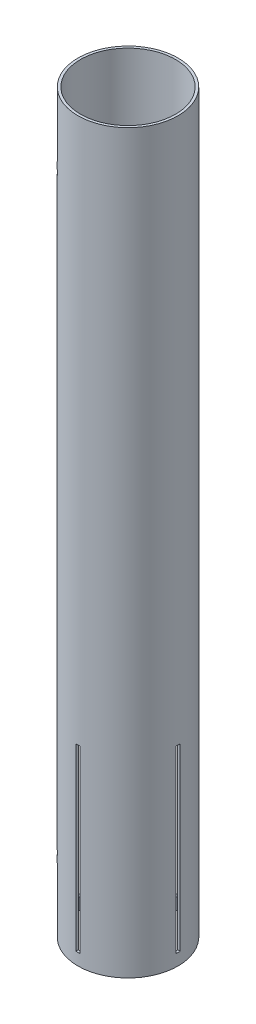
ISO-10303-21;
HEADER;
FILE_DESCRIPTION(('STEP AP214'),'2;1');
FILE_NAME('part.step','',(''),(''),'','','');
FILE_SCHEMA(('AUTOMOTIVE_DESIGN { 1 0 10303 214 1 1 1 1 }'));
ENDSEC;
DATA;
#1=APPLICATION_CONTEXT('core data for automotive mechanical design processes');
#2=APPLICATION_PROTOCOL_DEFINITION('international standard','automotive_design',2000,#1);
#3=PRODUCT_CONTEXT('',#1,'mechanical');
#4=PRODUCT('Part','Part','',(#3));
#5=PRODUCT_RELATED_PRODUCT_CATEGORY('part','',(#4));
#6=PRODUCT_DEFINITION_FORMATION('','',#4);
#7=PRODUCT_DEFINITION_CONTEXT('part definition',#1,'design');
#8=PRODUCT_DEFINITION('design','',#6,#7);
#9=PRODUCT_DEFINITION_SHAPE('','',#8);
#10=(LENGTH_UNIT() NAMED_UNIT(*) SI_UNIT(.MILLI.,.METRE.));
#11=(NAMED_UNIT(*) PLANE_ANGLE_UNIT() SI_UNIT($,.RADIAN.));
#12=(NAMED_UNIT(*) SI_UNIT($,.STERADIAN.) SOLID_ANGLE_UNIT());
#13=UNCERTAINTY_MEASURE_WITH_UNIT(LENGTH_MEASURE(1.E-05),#10,'distance_accuracy_value','');
#14=(GEOMETRIC_REPRESENTATION_CONTEXT(3) GLOBAL_UNCERTAINTY_ASSIGNED_CONTEXT((#13)) GLOBAL_UNIT_ASSIGNED_CONTEXT((#10,
#11,#12)) REPRESENTATION_CONTEXT('',''));
#15=CARTESIAN_POINT('',(0.,0.,0.));
#16=DIRECTION('',(0.,0.,1.));
#17=DIRECTION('',(1.,0.,0.));
#18=AXIS2_PLACEMENT_3D('',#15,#16,#17);
#19=CARTESIAN_POINT('',(0.,500.,0.));
#20=DIRECTION('',(0.,-1.,0.));
#21=DIRECTION('',(0.,0.,-1.));
#22=AXIS2_PLACEMENT_3D('',#19,#20,#21);
#23=CYLINDRICAL_SURFACE('',#22,33.9725);
#24=DIRECTION('',(0.,-1.,0.));
#25=VECTOR('',#24,1.);
#26=CARTESIAN_POINT('',(-33.9393688251564,500.,1.50000000000018));
#27=LINE('',#26,#25);
#28=CARTESIAN_POINT('',(-33.9393688251564,130.,1.50000000000013));
#29=VERTEX_POINT('',#28);
#30=CARTESIAN_POINT('',(-33.9393688251564,8.00000000000001,1.50000000000012));
#31=VERTEX_POINT('',#30);
#32=EDGE_CURVE('E240',#29,#31,#27,.T.);
#33=ORIENTED_EDGE('',*,*,#32,.T.);
#34=CARTESIAN_POINT('',(0.,8.00000000000001,0.));
#35=DIRECTION('',(0.,-1.,0.));
#36=DIRECTION('',(0.,0.,-1.));
#37=AXIS2_PLACEMENT_3D('',#34,#35,#36);
#38=CIRCLE('',#37,33.9725);
#39=CARTESIAN_POINT('',(-33.9393688251564,8.00000000000001,-1.49999999999988));
#40=VERTEX_POINT('',#39);
#41=EDGE_CURVE('E54',#31,#40,#38,.T.);
#42=ORIENTED_EDGE('',*,*,#41,.T.);
#43=DIRECTION('',(0.,-1.,0.));
#44=VECTOR('',#43,1.);
#45=CARTESIAN_POINT('',(-33.9393688251564,500.,-1.49999999999994));
#46=LINE('',#45,#44);
#47=CARTESIAN_POINT('',(-33.9393688251564,130.,-1.4999999999999));
#48=VERTEX_POINT('',#47);
#49=EDGE_CURVE('E172',#40,#48,#46,.F.);
#50=ORIENTED_EDGE('',*,*,#49,.T.);
#51=CARTESIAN_POINT('',(0.,130.,0.));
#52=DIRECTION('',(0.,1.,0.));
#53=DIRECTION('',(0.,0.,1.));
#54=AXIS2_PLACEMENT_3D('',#51,#52,#53);
#55=CIRCLE('',#54,33.9725);
#56=EDGE_CURVE('E234',#48,#29,#55,.T.);
#57=ORIENTED_EDGE('',*,*,#56,.T.);
#58=EDGE_LOOP('',(#33,#42,#50,#57));
#59=FACE_BOUND('',#58,.T.);
#60=DIRECTION('',(0.,-1.,0.));
#61=VECTOR('',#60,1.);
#62=CARTESIAN_POINT('',(33.9393688251564,500.,-1.50000000000018));
#63=LINE('',#62,#61);
#64=CARTESIAN_POINT('',(33.9393688251564,130.,-1.50000000000013));
#65=VERTEX_POINT('',#64);
#66=CARTESIAN_POINT('',(33.9393688251564,8.00000000000001,-1.50000000000012));
#67=VERTEX_POINT('',#66);
#68=EDGE_CURVE('E220',#65,#67,#63,.T.);
#69=ORIENTED_EDGE('',*,*,#68,.T.);
#70=CARTESIAN_POINT('',(33.9393688251564,8.00000000000001,1.49999999999988));
#71=VERTEX_POINT('',#70);
#72=EDGE_CURVE('E62',#67,#71,#38,.T.);
#73=ORIENTED_EDGE('',*,*,#72,.T.);
#74=DIRECTION('',(0.,-1.,0.));
#75=VECTOR('',#74,1.);
#76=CARTESIAN_POINT('',(33.9393688251564,500.,1.49999999999994));
#77=LINE('',#76,#75);
#78=CARTESIAN_POINT('',(33.9393688251564,130.,1.4999999999999));
#79=VERTEX_POINT('',#78);
#80=EDGE_CURVE('E210',#71,#79,#77,.F.);
#81=ORIENTED_EDGE('',*,*,#80,.T.);
#82=EDGE_CURVE('E235',#79,#65,#55,.T.);
#83=ORIENTED_EDGE('',*,*,#82,.T.);
#84=EDGE_LOOP('',(#69,#73,#81,#83));
#85=FACE_BOUND('',#84,.T.);
#86=DIRECTION('',(0.,-1.,0.));
#87=VECTOR('',#86,1.);
#88=CARTESIAN_POINT('',(1.50000000000006,500.,-33.9393688251564));
#89=LINE('',#88,#87);
#90=CARTESIAN_POINT('',(1.5,8.00000000000001,-33.9393688251564));
#91=VERTEX_POINT('',#90);
#92=CARTESIAN_POINT('',(1.50000000000001,130.,-33.9393688251564));
#93=VERTEX_POINT('',#92);
#94=EDGE_CURVE('E267',#91,#93,#89,.F.);
#95=ORIENTED_EDGE('',*,*,#94,.T.);
#96=CARTESIAN_POINT('',(0.,130.,0.));
#97=DIRECTION('',(0.,1.,0.));
#98=DIRECTION('',(0.,0.,1.));
#99=AXIS2_PLACEMENT_3D('',#96,#97,#98);
#100=CIRCLE('',#99,33.9725);
#101=CARTESIAN_POINT('',(-1.50000000000001,130.,-33.9393688251564));
#102=VERTEX_POINT('',#101);
#103=EDGE_CURVE('E278',#93,#102,#100,.T.);
#104=ORIENTED_EDGE('',*,*,#103,.T.);
#105=DIRECTION('',(0.,-1.,0.));
#106=VECTOR('',#105,1.);
#107=CARTESIAN_POINT('',(-1.50000000000006,500.,-33.9393688251564));
#108=LINE('',#107,#106);
#109=CARTESIAN_POINT('',(-1.5,8.00000000000001,-33.9393688251564));
#110=VERTEX_POINT('',#109);
#111=EDGE_CURVE('E283',#102,#110,#108,.T.);
#112=ORIENTED_EDGE('',*,*,#111,.T.);
#113=CARTESIAN_POINT('',(0.,8.00000000000001,0.));
#114=DIRECTION('',(0.,-1.,0.));
#115=DIRECTION('',(0.,0.,-1.));
#116=AXIS2_PLACEMENT_3D('',#113,#114,#115);
#117=CIRCLE('',#116,33.9725);
#118=EDGE_CURVE('E263',#110,#91,#117,.T.);
#119=ORIENTED_EDGE('',*,*,#118,.T.);
#120=EDGE_LOOP('',(#95,#104,#112,#119));
#121=FACE_BOUND('',#120,.T.);
#122=CARTESIAN_POINT('',(-1.50000000000001,130.,33.9393688251564));
#123=VERTEX_POINT('',#122);
#124=CARTESIAN_POINT('',(1.50000000000001,130.,33.9393688251564));
#125=VERTEX_POINT('',#124);
#126=EDGE_CURVE('E275',#123,#125,#100,.T.);
#127=ORIENTED_EDGE('',*,*,#126,.T.);
#128=DIRECTION('',(0.,-1.,0.));
#129=VECTOR('',#128,1.);
#130=CARTESIAN_POINT('',(1.50000000000006,500.,33.9393688251564));
#131=LINE('',#130,#129);
#132=CARTESIAN_POINT('',(1.5,8.00000000000001,33.9393688251564));
#133=VERTEX_POINT('',#132);
#134=EDGE_CURVE('E271',#125,#133,#131,.T.);
#135=ORIENTED_EDGE('',*,*,#134,.T.);
#136=CARTESIAN_POINT('',(-1.5,8.00000000000001,33.9393688251564));
#137=VERTEX_POINT('',#136);
#138=EDGE_CURVE('E266',#133,#137,#117,.T.);
#139=ORIENTED_EDGE('',*,*,#138,.T.);
#140=DIRECTION('',(0.,-1.,0.));
#141=VECTOR('',#140,1.);
#142=CARTESIAN_POINT('',(-1.50000000000006,500.,33.9393688251564));
#143=LINE('',#142,#141);
#144=EDGE_CURVE('E279',#137,#123,#143,.F.);
#145=ORIENTED_EDGE('',*,*,#144,.T.);
#146=EDGE_LOOP('',(#127,#135,#139,#145));
#147=FACE_BOUND('',#146,.T.);
#148=CARTESIAN_POINT('',(0.,500.,0.));
#149=DIRECTION('',(0.,1.,0.));
#150=DIRECTION('',(0.,0.,1.));
#151=AXIS2_PLACEMENT_3D('',#148,#149,#150);
#152=CIRCLE('',#151,33.9725);
#153=CARTESIAN_POINT('',(0.,500.,33.9725));
#154=VERTEX_POINT('',#153);
#155=EDGE_CURVE('E335',#154,#154,#152,.T.);
#156=ORIENTED_EDGE('',*,*,#155,.F.);
#157=EDGE_LOOP('',(#156));
#158=FACE_BOUND('',#157,.T.);
#159=CARTESIAN_POINT('',(0.,0.,0.));
#160=DIRECTION('',(0.,1.,0.));
#161=DIRECTION('',(0.,0.,1.));
#162=AXIS2_PLACEMENT_3D('',#159,#160,#161);
#163=CIRCLE('',#162,33.9725);
#164=CARTESIAN_POINT('',(0.,0.,33.9725));
#165=VERTEX_POINT('',#164);
#166=EDGE_CURVE('E323',#165,#165,#163,.T.);
#167=ORIENTED_EDGE('',*,*,#166,.T.);
#168=EDGE_LOOP('',(#167));
#169=FACE_BOUND('',#168,.T.);
#170=CARTESIAN_POINT('',(-25.2277292397217,450.,22.7528555055688));
#171=CARTESIAN_POINT('',(-25.2277266034803,449.901771722254,22.7528589982742));
#172=CARTESIAN_POINT('',(-25.2221664334747,449.80347387983,22.7590280902573));
#173=CARTESIAN_POINT('',(-25.2000396947857,449.609590171231,22.7835251344659));
#174=CARTESIAN_POINT('',(-25.1834601749632,449.514007634383,22.8018673938856));
#175=CARTESIAN_POINT('',(-25.1396960712382,449.328391176225,22.8501092383086));
#176=CARTESIAN_POINT('',(-25.1125169144157,449.238354442703,22.880002908846));
#177=CARTESIAN_POINT('',(-25.0482190955016,449.066357482103,22.9503755311126));
#178=CARTESIAN_POINT('',(-25.0111027718967,448.984395361047,22.9908519923699));
#179=CARTESIAN_POINT('',(-24.9277986928767,448.830762557362,23.0811475895228));
#180=CARTESIAN_POINT('',(-24.8816024984054,448.759101556947,23.1309754148467));
#181=CARTESIAN_POINT('',(-24.7813129701339,448.628187775444,23.2383878778816));
#182=CARTESIAN_POINT('',(-24.7272193133742,448.56893550204,23.2959728328061));
#183=CARTESIAN_POINT('',(-24.6124880635756,448.464494147677,23.4171548825114));
#184=CARTESIAN_POINT('',(-24.5518469630713,448.419312655278,23.4807551974355));
#185=CARTESIAN_POINT('',(-24.4256398741204,448.344344090873,23.6120129109985));
#186=CARTESIAN_POINT('',(-24.3600739246336,448.3145568971,23.6796702775418));
#187=CARTESIAN_POINT('',(-24.2258526050935,448.271248184254,23.8169692695279));
#188=CARTESIAN_POINT('',(-24.1572000566488,448.25771211075,23.8866090622001));
#189=CARTESIAN_POINT('',(-24.0186615285966,448.247244958155,24.0259089839155));
#190=CARTESIAN_POINT('',(-23.9487755591587,448.250313742219,24.0955691127863));
#191=CARTESIAN_POINT('',(-23.8098336197974,448.272957123338,24.2328725576708));
#192=CARTESIAN_POINT('',(-23.7407769252323,448.292516055707,24.3005177246648));
#193=CARTESIAN_POINT('',(-23.6054433389453,448.347560241705,24.4320017227964));
#194=CARTESIAN_POINT('',(-23.5391664594055,448.383045565121,24.4958405372539));
#195=CARTESIAN_POINT('',(-23.4113399425348,448.468953082202,24.6180370699147));
#196=CARTESIAN_POINT('',(-23.3497925803822,448.519382408869,24.6763921530897));
#197=CARTESIAN_POINT('',(-23.2333334625154,448.633741221555,24.7860723333918));
#198=CARTESIAN_POINT('',(-23.1784217567041,448.69767080909,24.8373973776504));
#199=CARTESIAN_POINT('',(-23.0768766634649,448.837303964168,24.9317737335363));
#200=CARTESIAN_POINT('',(-23.0302529668191,448.913021122926,24.9748153645488));
#201=CARTESIAN_POINT('',(-22.9468351575928,449.074032355847,25.0514816462202));
#202=CARTESIAN_POINT('',(-22.9100410477466,449.159326432674,25.0851062942597));
#203=CARTESIAN_POINT('',(-22.8474615765983,449.337078630856,25.1421171864754));
#204=CARTESIAN_POINT('',(-22.8216765976554,449.429537000902,25.1655030750491));
#205=CARTESIAN_POINT('',(-22.7819555523918,449.618989469516,25.2014678457572));
#206=CARTESIAN_POINT('',(-22.7680193914827,449.71598353187,25.2140468141625));
#207=CARTESIAN_POINT('',(-22.7524616005571,449.911634740305,25.2280867177168));
#208=CARTESIAN_POINT('',(-22.7508258384585,450.010289847286,25.2295604118584));
#209=CARTESIAN_POINT('',(-22.7598852315661,450.20656758908,25.2213880719538));
#210=CARTESIAN_POINT('',(-22.7705803434462,450.30419022752,25.2117420769781));
#211=CARTESIAN_POINT('',(-22.8039418778366,450.49557843173,25.1815704685149));
#212=CARTESIAN_POINT('',(-22.8266018477532,450.589346047145,25.1610507191723));
#213=CARTESIAN_POINT('',(-22.8831531488593,450.770425639233,25.1096298328353));
#214=CARTESIAN_POINT('',(-22.9170445490861,450.857737576219,25.0787286320281));
#215=CARTESIAN_POINT('',(-22.9950067522489,451.02351481093,25.0072631250145));
#216=CARTESIAN_POINT('',(-23.0390868188333,451.101971960579,24.966690023951));
#217=CARTESIAN_POINT('',(-23.1360132165445,451.247730534738,24.8768969429841));
#218=CARTESIAN_POINT('',(-23.1888596069598,451.315031883793,24.8276769045997));
#219=CARTESIAN_POINT('',(-23.3017254178744,451.436632351833,24.7217784812312));
#220=CARTESIAN_POINT('',(-23.3617515361043,451.490919185957,24.6650931270415));
#221=CARTESIAN_POINT('',(-23.4870955845484,451.584865628034,24.5457649072287));
#222=CARTESIAN_POINT('',(-23.5524134906732,451.62452530257,24.4831220687253));
#223=CARTESIAN_POINT('',(-23.6863412881098,451.688070164211,24.3535759355349));
#224=CARTESIAN_POINT('',(-23.7549495229567,451.711963201193,24.2866747791946));
#225=CARTESIAN_POINT('',(-23.8934659842238,451.743322257247,24.1504135380807));
#226=CARTESIAN_POINT('',(-23.9633742027116,451.750788376523,24.0810534683089));
#227=CARTESIAN_POINT('',(-24.1023969106473,451.74908070823,23.9419063768542));
#228=CARTESIAN_POINT('',(-24.1715122257146,451.739926185597,23.8721199428007));
#229=CARTESIAN_POINT('',(-24.3070974688914,451.705276934037,23.7340501098141));
#230=CARTESIAN_POINT('',(-24.373567392049,451.679782174525,23.6657667136945));
#231=CARTESIAN_POINT('',(-24.5020540258313,451.613180146834,23.5327147874738));
#232=CARTESIAN_POINT('',(-24.5640707095064,451.572072784183,23.4679462786443));
#233=CARTESIAN_POINT('',(-24.6820106467878,451.475415679703,23.3438737677258));
#234=CARTESIAN_POINT('',(-24.7379340841945,451.419866373681,23.2845696008153));
#235=CARTESIAN_POINT('',(-24.842308287082,451.295832910427,23.1731810058969));
#236=CARTESIAN_POINT('',(-24.8907511538322,451.227335248433,23.1211042150661));
#237=CARTESIAN_POINT('',(-24.9788874885179,451.079359773493,23.025858487679));
#238=CARTESIAN_POINT('',(-25.0185788021105,450.99987926475,22.9826917446484));
#239=CARTESIAN_POINT('',(-25.0882514438885,450.832128656658,22.906616244457));
#240=CARTESIAN_POINT('',(-25.1182231184705,450.743849931911,22.8737176869295));
#241=CARTESIAN_POINT('',(-25.1676454542652,450.561136716784,22.8193282493466));
#242=CARTESIAN_POINT('',(-25.1871085315654,450.46670963933,22.7978239073935));
#243=CARTESIAN_POINT('',(-25.2099496956917,450.309747371028,22.7725570452397));
#244=CARTESIAN_POINT('',(-25.2166096314108,450.248228640408,22.7651795444053));
#245=CARTESIAN_POINT('',(-25.2255002368035,450.124482586984,22.7553276700029));
#246=CARTESIAN_POINT('',(-25.2277309105227,450.062255264827,22.7528532919567));
#247=CARTESIAN_POINT('',(-25.2277292397217,450.,22.7528555055688));
#248=B_SPLINE_CURVE_WITH_KNOTS('',3,(#170,#171,#172,#173,#174,#175,#176,#177,#178,#179,#180,
#181,#182,#183,#184,#185,#186,#187,#188,#189,#190,#191,#192,#193,#194,#195,#196,#197,#198,#199,
#200,#201,#202,#203,#204,#205,#206,#207,#208,#209,#210,#211,#212,#213,#214,#215,#216,#217,#218,
#219,#220,#221,#222,#223,#224,#225,#226,#227,#228,#229,#230,#231,#232,#233,#234,#235,#236,#237,
#238,#239,#240,#241,#242,#243,#244,#245,#246,#247),.UNSPECIFIED.,.T.,.F.,(4,2,2,2,2,2,2,2,2,2,2,
2,2,2,2,2,2,2,2,2,2,2,2,2,2,2,2,2,2,2,2,2,2,2,2,2,2,2,4),(0.,0.294457575932065,
0.589261843891894,0.883915367981892,1.17849961290835,1.47335895755836,1.76823036359738,
2.06326052342507,2.35828834955921,2.65305175253015,2.94781272629011,3.24229400927292,
3.5367765826275,3.83139994405627,4.1260255210379,4.42099335591708,4.71596127284505,
5.01093943350058,5.30591523934223,5.60055209193795,5.89518790929498,6.18966499293851,
6.48414388670897,6.77889158454225,7.07364127589589,7.36866810601911,7.66369359318705,
7.95857208233191,8.2534487727283,8.54798389064392,8.84251955986804,9.13705701138363,
9.43158557582753,9.72642303707439,10.0213329967192,10.316534971952,10.6113873934801,
10.7980093269404,10.9846310899465),.UNSPECIFIED.);
#249=CARTESIAN_POINT('',(-25.2277292397217,450.,22.7528555055688));
#250=VERTEX_POINT('',#249);
#251=EDGE_CURVE('E288',#250,#250,#248,.T.);
#252=ORIENTED_EDGE('',*,*,#251,.F.);
#253=EDGE_LOOP('',(#252));
#254=FACE_BOUND('',#253,.T.);
#255=CARTESIAN_POINT('',(-25.2277292397217,50.,22.7528555055688));
#256=CARTESIAN_POINT('',(-25.2277266034803,49.9017717222543,22.7528589982742));
#257=CARTESIAN_POINT('',(-25.2221664334747,49.8034738798296,22.7590280902573));
#258=CARTESIAN_POINT('',(-25.2000396947857,49.6095901712313,22.7835251344659));
#259=CARTESIAN_POINT('',(-25.1834601749632,49.5140076343827,22.8018673938856));
#260=CARTESIAN_POINT('',(-25.1396960712382,49.3283911762248,22.8501092383086));
#261=CARTESIAN_POINT('',(-25.1125169144157,49.2383544427031,22.880002908846));
#262=CARTESIAN_POINT('',(-25.0482190955016,49.0663574821029,22.9503755311126));
#263=CARTESIAN_POINT('',(-25.0111027718967,48.9843953610473,22.9908519923698));
#264=CARTESIAN_POINT('',(-24.9277986928767,48.8307625573615,23.0811475895228));
#265=CARTESIAN_POINT('',(-24.8816024984053,48.7591015569471,23.1309754148467));
#266=CARTESIAN_POINT('',(-24.7813129701339,48.628187775444,23.2383878778817));
#267=CARTESIAN_POINT('',(-24.7272193133741,48.5689355020404,23.2959728328062));
#268=CARTESIAN_POINT('',(-24.6124880635755,48.4644941476772,23.4171548825115));
#269=CARTESIAN_POINT('',(-24.5518469630713,48.4193126552776,23.4807551974356));
#270=CARTESIAN_POINT('',(-24.4256398741204,48.3443440908729,23.6120129109985));
#271=CARTESIAN_POINT('',(-24.3600739246336,48.3145568971004,23.6796702775418));
#272=CARTESIAN_POINT('',(-24.2258526050935,48.2712481842538,23.8169692695279));
#273=CARTESIAN_POINT('',(-24.1572000566488,48.2577121107499,23.8866090622001));
#274=CARTESIAN_POINT('',(-24.0186615285965,48.2472449581545,24.0259089839155));
#275=CARTESIAN_POINT('',(-23.9487755591586,48.2503137422186,24.0955691127863));
#276=CARTESIAN_POINT('',(-23.8098336197974,48.2729571233376,24.2328725576708));
#277=CARTESIAN_POINT('',(-23.7407769252323,48.2925160557067,24.3005177246648));
#278=CARTESIAN_POINT('',(-23.6054433389453,48.3475602417051,24.4320017227964));
#279=CARTESIAN_POINT('',(-23.5391664594055,48.3830455651208,24.4958405372539));
#280=CARTESIAN_POINT('',(-23.4113399425348,48.4689530822019,24.6180370699147));
#281=CARTESIAN_POINT('',(-23.3497925803822,48.5193824088691,24.6763921530897));
#282=CARTESIAN_POINT('',(-23.2333334625154,48.6337412215546,24.7860723333918));
#283=CARTESIAN_POINT('',(-23.1784217567041,48.6976708090905,24.8373973776505));
#284=CARTESIAN_POINT('',(-23.0768766634649,48.8373039641681,24.9317737335364));
#285=CARTESIAN_POINT('',(-23.0302529668191,48.9130211229257,24.9748153645489));
#286=CARTESIAN_POINT('',(-22.9468351575928,49.0740323558466,25.0514816462202));
#287=CARTESIAN_POINT('',(-22.9100410477466,49.1593264326739,25.0851062942597));
#288=CARTESIAN_POINT('',(-22.8474615765983,49.3370786308556,25.1421171864754));
#289=CARTESIAN_POINT('',(-22.8216765976554,49.4295370009021,25.1655030750491));
#290=CARTESIAN_POINT('',(-22.7819555523918,49.6189894695164,25.2014678457572));
#291=CARTESIAN_POINT('',(-22.7680193914827,49.7159835318697,25.2140468141625));
#292=CARTESIAN_POINT('',(-22.7524616005571,49.9116347403052,25.2280867177168));
#293=CARTESIAN_POINT('',(-22.7508258384585,50.010289847286,25.2295604118584));
#294=CARTESIAN_POINT('',(-22.7598852315661,50.2065675890803,25.2213880719538));
#295=CARTESIAN_POINT('',(-22.7705803434462,50.3041902275203,25.2117420769781));
#296=CARTESIAN_POINT('',(-22.8039418778366,50.4955784317298,25.1815704685149));
#297=CARTESIAN_POINT('',(-22.8266018477532,50.589346047145,25.1610507191723));
#298=CARTESIAN_POINT('',(-22.8831531488593,50.7704256392326,25.1096298328353));
#299=CARTESIAN_POINT('',(-22.9170445490861,50.857737576219,25.0787286320281));
#300=CARTESIAN_POINT('',(-22.9950067522489,51.0235148109297,25.0072631250145));
#301=CARTESIAN_POINT('',(-23.0390868188333,51.101971960579,24.9666900239509));
#302=CARTESIAN_POINT('',(-23.1360132165445,51.247730534738,24.8768969429841));
#303=CARTESIAN_POINT('',(-23.1888596069598,51.3150318837926,24.8276769045996));
#304=CARTESIAN_POINT('',(-23.3017254178744,51.4366323518332,24.7217784812312));
#305=CARTESIAN_POINT('',(-23.3617515361043,51.4909191859567,24.6650931270415));
#306=CARTESIAN_POINT('',(-23.4870955845484,51.5848656280343,24.5457649072287));
#307=CARTESIAN_POINT('',(-23.5524134906733,51.62452530257,24.4831220687252));
#308=CARTESIAN_POINT('',(-23.6863412881099,51.6880701642112,24.3535759355349));
#309=CARTESIAN_POINT('',(-23.7549495229567,51.7119632011932,24.2866747791946));
#310=CARTESIAN_POINT('',(-23.8934659842238,51.7433222572473,24.1504135380806));
#311=CARTESIAN_POINT('',(-23.9633742027117,51.7507883765227,24.0810534683088));
#312=CARTESIAN_POINT('',(-24.1023969106474,51.7490807082304,23.9419063768541));
#313=CARTESIAN_POINT('',(-24.1715122257146,51.7399261855975,23.8721199428007));
#314=CARTESIAN_POINT('',(-24.3070974688914,51.7052769340373,23.7340501098141));
#315=CARTESIAN_POINT('',(-24.373567392049,51.6797821745247,23.6657667136945));
#316=CARTESIAN_POINT('',(-24.5020540258314,51.6131801468339,23.5327147874738));
#317=CARTESIAN_POINT('',(-24.5640707095065,51.5720727841825,23.4679462786443));
#318=CARTESIAN_POINT('',(-24.6820106467878,51.4754156797027,23.3438737677258));
#319=CARTESIAN_POINT('',(-24.7379340841945,51.4198663736814,23.2845696008153));
#320=CARTESIAN_POINT('',(-24.842308287082,51.2958329104272,23.1731810058969));
#321=CARTESIAN_POINT('',(-24.8907511538323,51.2273352484326,23.1211042150661));
#322=CARTESIAN_POINT('',(-24.9788874885179,51.079359773493,23.025858487679));
#323=CARTESIAN_POINT('',(-25.0185788021105,50.9998792647501,22.9826917446483));
#324=CARTESIAN_POINT('',(-25.0882514438885,50.8321286566577,22.906616244457));
#325=CARTESIAN_POINT('',(-25.1182231184705,50.7438499319105,22.8737176869295));
#326=CARTESIAN_POINT('',(-25.1676454542652,50.5611367167839,22.8193282493466));
#327=CARTESIAN_POINT('',(-25.1871085315654,50.4667096393303,22.7978239073935));
#328=CARTESIAN_POINT('',(-25.2099496956917,50.3097473710276,22.7725570452397));
#329=CARTESIAN_POINT('',(-25.2166096314108,50.2482286404083,22.7651795444053));
#330=CARTESIAN_POINT('',(-25.2255002368035,50.1244825869843,22.7553276700029));
#331=CARTESIAN_POINT('',(-25.2277309105227,50.062255264827,22.7528532919567));
#332=CARTESIAN_POINT('',(-25.2277292397217,50.,22.7528555055688));
#333=B_SPLINE_CURVE_WITH_KNOTS('',3,(#255,#256,#257,#258,#259,#260,#261,#262,#263,#264,#265,
#266,#267,#268,#269,#270,#271,#272,#273,#274,#275,#276,#277,#278,#279,#280,#281,#282,#283,#284,
#285,#286,#287,#288,#289,#290,#291,#292,#293,#294,#295,#296,#297,#298,#299,#300,#301,#302,#303,
#304,#305,#306,#307,#308,#309,#310,#311,#312,#313,#314,#315,#316,#317,#318,#319,#320,#321,#322,
#323,#324,#325,#326,#327,#328,#329,#330,#331,#332),.UNSPECIFIED.,.T.,.F.,(4,2,2,2,2,2,2,2,2,2,2,
2,2,2,2,2,2,2,2,2,2,2,2,2,2,2,2,2,2,2,2,2,2,2,2,2,2,2,4),(0.,0.294457575932148,
0.589261843891917,0.883915367981921,1.17849961290833,1.47335895755843,1.76823036359743,
2.06326052342513,2.35828834955921,2.65305175253016,2.94781272629014,3.24229400927292,
3.53677658262754,3.83139994405629,4.12602552103794,4.42099335591711,4.71596127284509,
5.01093943350063,5.30591523934227,5.60055209193794,5.89518790929496,6.18966499293854,
6.48414388670902,6.77889158454229,7.07364127589595,7.36866810601917,7.66369359318708,
7.95857208233195,8.25344877272834,8.54798389064396,8.84251955986807,9.1370570113837,
9.43158557582758,9.72642303707446,10.0213329967193,10.3165349719521,10.6113873934801,
10.7980093269404,10.9846310899465),.UNSPECIFIED.);
#334=CARTESIAN_POINT('',(-25.2277292397217,50.,22.7528555055688));
#335=VERTEX_POINT('',#334);
#336=EDGE_CURVE('E297',#335,#335,#333,.T.);
#337=ORIENTED_EDGE('',*,*,#336,.F.);
#338=EDGE_LOOP('',(#337));
#339=FACE_BOUND('',#338,.T.);
#340=ADVANCED_FACE('F38',(#59,#85,#121,#147,#158,#169,#254,#339),#23,.T.);
#341=CARTESIAN_POINT('',(0.,500.,0.));
#342=DIRECTION('',(0.,-1.,0.));
#343=DIRECTION('',(0.,0.,-1.));
#344=AXIS2_PLACEMENT_3D('',#341,#342,#343);
#345=CYLINDRICAL_SURFACE('',#344,32.258);
#346=DIRECTION('',(0.,-1.,0.));
#347=VECTOR('',#346,1.);
#348=CARTESIAN_POINT('',(32.2231060576103,500.,1.49999999999995));
#349=LINE('',#348,#347);
#350=CARTESIAN_POINT('',(32.2231060576103,8.00000000000001,1.49999999999989));
#351=VERTEX_POINT('',#350);
#352=CARTESIAN_POINT('',(32.2231060576103,130.,1.4999999999999));
#353=VERTEX_POINT('',#352);
#354=EDGE_CURVE('E11',#351,#353,#349,.F.);
#355=ORIENTED_EDGE('',*,*,#354,.F.);
#356=CARTESIAN_POINT('',(0.,8.00000000000001,0.));
#357=DIRECTION('',(0.,-1.,0.));
#358=DIRECTION('',(0.,0.,-1.));
#359=AXIS2_PLACEMENT_3D('',#356,#357,#358);
#360=CIRCLE('',#359,32.258);
#361=CARTESIAN_POINT('',(32.2231060576103,8.00000000000001,-1.50000000000011));
#362=VERTEX_POINT('',#361);
#363=EDGE_CURVE('E167',#362,#351,#360,.T.);
#364=ORIENTED_EDGE('',*,*,#363,.F.);
#365=DIRECTION('',(0.,-1.,0.));
#366=VECTOR('',#365,1.);
#367=CARTESIAN_POINT('',(32.2231060576103,500.,-1.50000000000017));
#368=LINE('',#367,#366);
#369=CARTESIAN_POINT('',(32.2231060576103,130.,-1.50000000000013));
#370=VERTEX_POINT('',#369);
#371=EDGE_CURVE('E189',#370,#362,#368,.T.);
#372=ORIENTED_EDGE('',*,*,#371,.F.);
#373=CARTESIAN_POINT('',(0.,130.,0.));
#374=DIRECTION('',(0.,1.,0.));
#375=DIRECTION('',(0.,0.,1.));
#376=AXIS2_PLACEMENT_3D('',#373,#374,#375);
#377=CIRCLE('',#376,32.258);
#378=EDGE_CURVE('E47',#353,#370,#377,.T.);
#379=ORIENTED_EDGE('',*,*,#378,.F.);
#380=EDGE_LOOP('',(#355,#364,#372,#379));
#381=FACE_BOUND('',#380,.T.);
#382=DIRECTION('',(0.,-1.,0.));
#383=VECTOR('',#382,1.);
#384=CARTESIAN_POINT('',(-32.2231060576103,500.,1.50000000000017));
#385=LINE('',#384,#383);
#386=CARTESIAN_POINT('',(-32.2231060576103,130.,1.50000000000013));
#387=VERTEX_POINT('',#386);
#388=CARTESIAN_POINT('',(-32.2231060576103,8.00000000000001,1.50000000000011));
#389=VERTEX_POINT('',#388);
#390=EDGE_CURVE('E184',#387,#389,#385,.T.);
#391=ORIENTED_EDGE('',*,*,#390,.F.);
#392=CARTESIAN_POINT('',(-32.2231060576103,130.,-1.4999999999999));
#393=VERTEX_POINT('',#392);
#394=EDGE_CURVE('E180',#393,#387,#377,.T.);
#395=ORIENTED_EDGE('',*,*,#394,.F.);
#396=DIRECTION('',(0.,-1.,0.));
#397=VECTOR('',#396,1.);
#398=CARTESIAN_POINT('',(-32.2231060576103,500.,-1.49999999999995));
#399=LINE('',#398,#397);
#400=CARTESIAN_POINT('',(-32.2231060576103,8.00000000000001,-1.49999999999989));
#401=VERTEX_POINT('',#400);
#402=EDGE_CURVE('E164',#401,#393,#399,.F.);
#403=ORIENTED_EDGE('',*,*,#402,.F.);
#404=EDGE_CURVE('E152',#389,#401,#360,.T.);
#405=ORIENTED_EDGE('',*,*,#404,.F.);
#406=EDGE_LOOP('',(#391,#395,#403,#405));
#407=FACE_BOUND('',#406,.T.);
#408=DIRECTION('',(0.,-1.,0.));
#409=VECTOR('',#408,1.);
#410=CARTESIAN_POINT('',(-1.50000000000006,500.,32.2231060576103));
#411=LINE('',#410,#409);
#412=CARTESIAN_POINT('',(-1.5,8.00000000000001,32.2231060576103));
#413=VERTEX_POINT('',#412);
#414=CARTESIAN_POINT('',(-1.50000000000001,130.,32.2231060576103));
#415=VERTEX_POINT('',#414);
#416=EDGE_CURVE('E165',#413,#415,#411,.F.);
#417=ORIENTED_EDGE('',*,*,#416,.F.);
#418=CARTESIAN_POINT('',(0.,8.00000000000001,0.));
#419=DIRECTION('',(0.,-1.,0.));
#420=DIRECTION('',(0.,0.,-1.));
#421=AXIS2_PLACEMENT_3D('',#418,#419,#420);
#422=CIRCLE('',#421,32.258);
#423=CARTESIAN_POINT('',(1.5,8.00000000000001,32.2231060576103));
#424=VERTEX_POINT('',#423);
#425=EDGE_CURVE('E336',#424,#413,#422,.T.);
#426=ORIENTED_EDGE('',*,*,#425,.F.);
#427=DIRECTION('',(0.,-1.,0.));
#428=VECTOR('',#427,1.);
#429=CARTESIAN_POINT('',(1.50000000000006,500.,32.2231060576103));
#430=LINE('',#429,#428);
#431=CARTESIAN_POINT('',(1.50000000000001,130.,32.2231060576103));
#432=VERTEX_POINT('',#431);
#433=EDGE_CURVE('E347',#432,#424,#430,.T.);
#434=ORIENTED_EDGE('',*,*,#433,.F.);
#435=CARTESIAN_POINT('',(0.,130.,0.));
#436=DIRECTION('',(0.,1.,0.));
#437=DIRECTION('',(0.,0.,1.));
#438=AXIS2_PLACEMENT_3D('',#435,#436,#437);
#439=CIRCLE('',#438,32.258);
#440=EDGE_CURVE('E343',#415,#432,#439,.T.);
#441=ORIENTED_EDGE('',*,*,#440,.F.);
#442=EDGE_LOOP('',(#417,#426,#434,#441));
#443=FACE_BOUND('',#442,.T.);
#444=DIRECTION('',(0.,-1.,0.));
#445=VECTOR('',#444,1.);
#446=CARTESIAN_POINT('',(-1.50000000000006,500.,-32.2231060576103));
#447=LINE('',#446,#445);
#448=CARTESIAN_POINT('',(-1.50000000000001,130.,-32.2231060576103));
#449=VERTEX_POINT('',#448);
#450=CARTESIAN_POINT('',(-1.5,8.00000000000001,-32.2231060576103));
#451=VERTEX_POINT('',#450);
#452=EDGE_CURVE('E342',#449,#451,#447,.T.);
#453=ORIENTED_EDGE('',*,*,#452,.F.);
#454=CARTESIAN_POINT('',(1.50000000000001,130.,-32.2231060576103));
#455=VERTEX_POINT('',#454);
#456=EDGE_CURVE('E339',#455,#449,#439,.T.);
#457=ORIENTED_EDGE('',*,*,#456,.F.);
#458=DIRECTION('',(0.,-1.,0.));
#459=VECTOR('',#458,1.);
#460=CARTESIAN_POINT('',(1.50000000000006,500.,-32.2231060576103));
#461=LINE('',#460,#459);
#462=CARTESIAN_POINT('',(1.5,8.00000000000001,-32.2231060576103));
#463=VERTEX_POINT('',#462);
#464=EDGE_CURVE('E334',#463,#455,#461,.F.);
#465=ORIENTED_EDGE('',*,*,#464,.F.);
#466=EDGE_CURVE('E331',#451,#463,#422,.T.);
#467=ORIENTED_EDGE('',*,*,#466,.F.);
#468=EDGE_LOOP('',(#453,#457,#465,#467));
#469=FACE_BOUND('',#468,.T.);
#470=CARTESIAN_POINT('',(-24.0136971395619,450.,21.538823405409));
#471=CARTESIAN_POINT('',(-24.0136945278192,449.901779362963,21.5388269184466));
#472=CARTESIAN_POINT('',(-24.0081514457334,449.803489348025,21.5450112812197));
#473=CARTESIAN_POINT('',(-23.9860914915992,449.609621603332,21.56956747052));
#474=CARTESIAN_POINT('',(-23.9695617390733,449.514047194584,21.5879536020346));
#475=CARTESIAN_POINT('',(-23.9259248233379,449.328447034708,21.6363060556616));
#476=CARTESIAN_POINT('',(-23.8988231124277,449.238418451087,21.6662664084986));
#477=CARTESIAN_POINT('',(-23.8346997085422,449.066436177947,21.7367871143396));
#478=CARTESIAN_POINT('',(-23.7976803350141,448.984480606512,21.7773449888428));
#479=CARTESIAN_POINT('',(-23.714575567438,448.830851009161,21.8678127613682));
#480=CARTESIAN_POINT('',(-23.6684809250971,448.759187601558,21.9177321969488));
#481=CARTESIAN_POINT('',(-23.5683905286135,448.628267250179,22.0253244932029));
#482=CARTESIAN_POINT('',(-23.5143944499064,448.569010816283,22.0829976723664));
#483=CARTESIAN_POINT('',(-23.3998397297428,448.464556066123,22.2043468780445));
#484=CARTESIAN_POINT('',(-23.3392771743644,448.419366196979,22.2680264816908));
#485=CARTESIAN_POINT('',(-23.2132021205778,448.344381516787,22.3994217048357));
#486=CARTESIAN_POINT('',(-23.1476896645223,448.314586574034,22.4671372898002));
#487=CARTESIAN_POINT('',(-23.0135508291437,448.271266048986,22.6045182389784));
#488=CARTESIAN_POINT('',(-22.9449276100064,448.257724323299,22.6741815980663));
#489=CARTESIAN_POINT('',(-22.8064146704861,448.247244801018,22.8134973439647));
#490=CARTESIAN_POINT('',(-22.736524961434,448.250306855949,22.8831497308677));
#491=CARTESIAN_POINT('',(-22.5975507438219,448.272934605175,23.0203995431753));
#492=CARTESIAN_POINT('',(-22.5284654652623,448.292482927332,23.0879990541148));
#493=CARTESIAN_POINT('',(-22.393046259274,448.347501367069,23.219365807034));
#494=CARTESIAN_POINT('',(-22.3267123448819,448.382971560083,23.2831330308562));
#495=CARTESIAN_POINT('',(-22.198746303741,448.468846637946,23.4051715875565));
#496=CARTESIAN_POINT('',(-22.1371166864119,448.519259424596,23.4634399910537));
#497=CARTESIAN_POINT('',(-22.0204799092832,448.63358289295,23.5729386843584));
#498=CARTESIAN_POINT('',(-21.9654728050067,448.69749368781,23.6241689151583));
#499=CARTESIAN_POINT('',(-21.8637269899555,448.837097158631,23.7183648295744));
#500=CARTESIAN_POINT('',(-21.8169990236057,448.912804908438,23.7613197799909));
#501=CARTESIAN_POINT('',(-21.733382240143,449.073800315164,23.8378246218964));
#502=CARTESIAN_POINT('',(-21.6964934260111,449.159087974985,23.8713745105358));
#503=CARTESIAN_POINT('',(-21.6337440337092,449.336831518898,23.9282570537867));
#504=CARTESIAN_POINT('',(-21.6078838906336,449.429287685627,23.9515893053009));
#505=CARTESIAN_POINT('',(-21.5680404194827,449.618739523352,23.9874742648327));
#506=CARTESIAN_POINT('',(-21.5540569862394,449.715735154143,24.000027068302));
#507=CARTESIAN_POINT('',(-21.5384384496635,449.911380219396,24.014044755495));
#508=CARTESIAN_POINT('',(-21.5367876322353,450.010027388706,24.0155237493615));
#509=CARTESIAN_POINT('',(-21.5458474136958,450.206291640945,24.0073959194251));
#510=CARTESIAN_POINT('',(-21.5565579643303,450.303908727892,23.9977891388972));
#511=CARTESIAN_POINT('',(-21.5899768087174,450.495282461762,23.967727569305));
#512=CARTESIAN_POINT('',(-21.6126779194591,450.589041383731,23.9472792748815));
#513=CARTESIAN_POINT('',(-21.669331291848,450.770107443336,23.8960267840088));
#514=CARTESIAN_POINT('',(-21.70328363028,450.857414536934,23.8652225168844));
#515=CARTESIAN_POINT('',(-21.7813831277249,451.023195587153,23.7939635119041));
#516=CARTESIAN_POINT('',(-21.8255405696003,451.101660514799,23.753499038869));
#517=CARTESIAN_POINT('',(-21.9226255476029,451.247439037428,23.6639262116558));
#518=CARTESIAN_POINT('',(-21.9755531491713,451.314752549194,23.6148177929784));
#519=CARTESIAN_POINT('',(-22.0885814514634,451.436388440386,23.509128326588));
#520=CARTESIAN_POINT('',(-22.1486895798472,451.490697189965,23.45253953449));
#521=CARTESIAN_POINT('',(-22.2741837840903,451.584688726257,23.3333833280011));
#522=CARTESIAN_POINT('',(-22.339569833941,451.624371585039,23.2708159430714));
#523=CARTESIAN_POINT('',(-22.4736085184092,451.687961094533,23.1413947559571));
#524=CARTESIAN_POINT('',(-22.5422593312971,451.711876435265,23.07454333718));
#525=CARTESIAN_POINT('',(-22.6808334373249,451.743280491962,22.9383476439469));
#526=CARTESIAN_POINT('',(-22.7507567216003,451.750769322317,22.8690033868535));
#527=CARTESIAN_POINT('',(-22.8897709471379,451.749106693642,22.7298616224197));
#528=CARTESIAN_POINT('',(-22.9588628422286,451.739976598062,22.6600648117445));
#529=CARTESIAN_POINT('',(-23.0943737121009,451.705379492402,22.5219411073313));
#530=CARTESIAN_POINT('',(-23.1607926819422,451.679912452128,22.4536142163102));
#531=CARTESIAN_POINT('',(-23.289155368419,451.613368907674,22.3204472715513));
#532=CARTESIAN_POINT('',(-23.3510990697514,451.572292350121,22.2556072297369));
#533=CARTESIAN_POINT('',(-23.4688800931035,451.475699190255,22.1313706713808));
#534=CARTESIAN_POINT('',(-23.5247175933201,451.420183009492,22.071973995994));
#535=CARTESIAN_POINT('',(-23.6289242208758,451.296208989159,21.9603813769915));
#536=CARTESIAN_POINT('',(-23.677284502671,451.227736031393,21.9081939695902));
#537=CARTESIAN_POINT('',(-23.7652625498286,451.079806379817,21.8127276261226));
#538=CARTESIAN_POINT('',(-23.8048781649395,451.000346992317,21.7694508813005));
#539=CARTESIAN_POINT('',(-23.8744184129231,450.832628667495,21.6931644779012));
#540=CARTESIAN_POINT('',(-23.9043328490579,450.744360598097,21.6601656236653));
#541=CARTESIAN_POINT('',(-23.9536647550536,450.561661838158,21.6055982246014));
#542=CARTESIAN_POINT('',(-23.9730945911568,450.467238555538,21.5840162145734));
#543=CARTESIAN_POINT('',(-23.9959173861942,450.31019284058,21.5586334362908));
#544=CARTESIAN_POINT('',(-24.0025774448416,450.248586992943,21.5512153952942));
#545=CARTESIAN_POINT('',(-24.0114681481675,450.124663414054,21.5413092674178));
#546=CARTESIAN_POINT('',(-24.0136987973692,450.062345683528,21.5388211755036));
#547=CARTESIAN_POINT('',(-24.0136971395619,450.,21.538823405409));
#548=B_SPLINE_CURVE_WITH_KNOTS('',3,(#470,#471,#472,#473,#474,#475,#476,#477,#478,#479,#480,
#481,#482,#483,#484,#485,#486,#487,#488,#489,#490,#491,#492,#493,#494,#495,#496,#497,#498,#499,
#500,#501,#502,#503,#504,#505,#506,#507,#508,#509,#510,#511,#512,#513,#514,#515,#516,#517,#518,
#519,#520,#521,#522,#523,#524,#525,#526,#527,#528,#529,#530,#531,#532,#533,#534,#535,#536,#537,
#538,#539,#540,#541,#542,#543,#544,#545,#546,#547),.UNSPECIFIED.,.T.,.F.,(4,2,2,2,2,2,2,2,2,2,2,
2,2,2,2,2,2,2,2,2,2,2,2,2,2,2,2,2,2,2,2,2,2,2,2,2,2,2,4),(0.,0.294434320727132,
0.589214438652561,0.883842729548583,1.17840217568245,1.4732633655478,1.76813667072172,
2.06318671031755,2.35823422566358,2.65298844401198,2.9477400266021,3.24218140697358,
3.53662418232088,3.83122294070961,4.12582416884553,4.42080496528086,4.71578585108661,
5.01077837316654,5.30576828306769,5.60038225556601,5.89499507800023,6.18943161083904,
6.48387015312323,6.77860668105348,7.07334540834491,7.36839170232164,7.66343654245513,
7.95831863702389,8.25319867813183,8.5476999218115,8.84220170979039,9.13670450477067,
9.43119870300579,9.72603866512503,10.0209510457387,10.3161724063761,10.6110447977436,
10.7979375758713,10.9848301631477),.UNSPECIFIED.);
#549=CARTESIAN_POINT('',(-24.0136971395619,450.,21.538823405409));
#550=VERTEX_POINT('',#549);
#551=EDGE_CURVE('E287',#550,#550,#548,.T.);
#552=ORIENTED_EDGE('',*,*,#551,.T.);
#553=EDGE_LOOP('',(#552));
#554=FACE_BOUND('',#553,.T.);
#555=CARTESIAN_POINT('',(0.,500.,0.));
#556=DIRECTION('',(0.,1.,0.));
#557=DIRECTION('',(0.,0.,1.));
#558=AXIS2_PLACEMENT_3D('',#555,#556,#557);
#559=CIRCLE('',#558,32.258);
#560=CARTESIAN_POINT('',(0.,500.,32.258));
#561=VERTEX_POINT('',#560);
#562=EDGE_CURVE('E373',#561,#561,#559,.T.);
#563=ORIENTED_EDGE('',*,*,#562,.T.);
#564=EDGE_LOOP('',(#563));
#565=FACE_BOUND('',#564,.T.);
#566=CARTESIAN_POINT('',(0.,0.,0.));
#567=DIRECTION('',(0.,1.,0.));
#568=DIRECTION('',(0.,0.,1.));
#569=AXIS2_PLACEMENT_3D('',#566,#567,#568);
#570=CIRCLE('',#569,32.258);
#571=CARTESIAN_POINT('',(0.,0.,32.258));
#572=VERTEX_POINT('',#571);
#573=EDGE_CURVE('E376',#572,#572,#570,.T.);
#574=ORIENTED_EDGE('',*,*,#573,.F.);
#575=EDGE_LOOP('',(#574));
#576=FACE_BOUND('',#575,.T.);
#577=CARTESIAN_POINT('',(-24.0136971395619,50.,21.538823405409));
#578=CARTESIAN_POINT('',(-24.0136945278192,49.9017793629633,21.5388269184466));
#579=CARTESIAN_POINT('',(-24.0081514457334,49.8034893480246,21.5450112812197));
#580=CARTESIAN_POINT('',(-23.9860914915992,49.6096216033322,21.56956747052));
#581=CARTESIAN_POINT('',(-23.9695617390733,49.5140471945844,21.5879536020346));
#582=CARTESIAN_POINT('',(-23.9259248233379,49.3284470347079,21.6363060556616));
#583=CARTESIAN_POINT('',(-23.8988231124277,49.2384184510868,21.6662664084986));
#584=CARTESIAN_POINT('',(-23.8346997085422,49.0664361779473,21.7367871143396));
#585=CARTESIAN_POINT('',(-23.7976803350141,48.9844806065121,21.7773449888428));
#586=CARTESIAN_POINT('',(-23.714575567438,48.8308510091605,21.8678127613683));
#587=CARTESIAN_POINT('',(-23.6684809250971,48.7591876015579,21.9177321969488));
#588=CARTESIAN_POINT('',(-23.5683905286134,48.6282672501791,22.0253244932029));
#589=CARTESIAN_POINT('',(-23.5143944499064,48.569010816283,22.0829976723664));
#590=CARTESIAN_POINT('',(-23.3998397297428,48.4645560661228,22.2043468780446));
#591=CARTESIAN_POINT('',(-23.3392771743644,48.4193661969786,22.2680264816908));
#592=CARTESIAN_POINT('',(-23.2132021205777,48.3443815167874,22.3994217048357));
#593=CARTESIAN_POINT('',(-23.1476896645223,48.314586574034,22.4671372898003));
#594=CARTESIAN_POINT('',(-23.0135508291437,48.2712660489857,22.6045182389784));
#595=CARTESIAN_POINT('',(-22.9449276100064,48.2577243232989,22.6741815980663));
#596=CARTESIAN_POINT('',(-22.8064146704861,48.247244801018,22.8134973439647));
#597=CARTESIAN_POINT('',(-22.736524961434,48.2503068559487,22.8831497308677));
#598=CARTESIAN_POINT('',(-22.5975507438218,48.2729346051746,23.0203995431753));
#599=CARTESIAN_POINT('',(-22.5284654652623,48.2924829273316,23.0879990541148));
#600=CARTESIAN_POINT('',(-22.3930462592739,48.3475013670695,23.2193658070341));
#601=CARTESIAN_POINT('',(-22.3267123448818,48.3829715600826,23.2831330308562));
#602=CARTESIAN_POINT('',(-22.198746303741,48.4688466379465,23.4051715875565));
#603=CARTESIAN_POINT('',(-22.1371166864119,48.5192594245962,23.4634399910537));
#604=CARTESIAN_POINT('',(-22.0204799092832,48.6335828929505,23.5729386843585));
#605=CARTESIAN_POINT('',(-21.9654728050067,48.6974936878101,23.6241689151583));
#606=CARTESIAN_POINT('',(-21.8637269899555,48.837097158631,23.7183648295744));
#607=CARTESIAN_POINT('',(-21.8169990236057,48.9128049084383,23.7613197799909));
#608=CARTESIAN_POINT('',(-21.733382240143,49.0738003151641,23.8378246218964));
#609=CARTESIAN_POINT('',(-21.6964934260111,49.159087974985,23.8713745105358));
#610=CARTESIAN_POINT('',(-21.6337440337093,49.3368315188984,23.9282570537867));
#611=CARTESIAN_POINT('',(-21.6078838906337,49.4292876856271,23.9515893053009));
#612=CARTESIAN_POINT('',(-21.5680404194827,49.6187395233516,23.9874742648327));
#613=CARTESIAN_POINT('',(-21.5540569862394,49.7157351541427,24.000027068302));
#614=CARTESIAN_POINT('',(-21.5384384496635,49.9113802193962,24.014044755495));
#615=CARTESIAN_POINT('',(-21.5367876322353,50.0100273887065,24.0155237493615));
#616=CARTESIAN_POINT('',(-21.5458474136959,50.2062916409445,24.0073959194251));
#617=CARTESIAN_POINT('',(-21.5565579643303,50.3039087278919,23.9977891388972));
#618=CARTESIAN_POINT('',(-21.5899768087174,50.4952824617617,23.967727569305));
#619=CARTESIAN_POINT('',(-21.6126779194592,50.5890413837312,23.9472792748815));
#620=CARTESIAN_POINT('',(-21.669331291848,50.7701074433356,23.8960267840087));
#621=CARTESIAN_POINT('',(-21.70328363028,50.8574145369345,23.8652225168844));
#622=CARTESIAN_POINT('',(-21.7813831277249,51.0231955871526,23.7939635119041));
#623=CARTESIAN_POINT('',(-21.8255405696003,51.1016605147986,23.753499038869));
#624=CARTESIAN_POINT('',(-21.9226255476029,51.2474390374277,23.6639262116558));
#625=CARTESIAN_POINT('',(-21.9755531491713,51.3147525491938,23.6148177929783));
#626=CARTESIAN_POINT('',(-22.0885814514635,51.4363884403861,23.509128326588));
#627=CARTESIAN_POINT('',(-22.1486895798472,51.4906971899647,23.4525395344899));
#628=CARTESIAN_POINT('',(-22.2741837840903,51.584688726257,23.333383328001));
#629=CARTESIAN_POINT('',(-22.3395698339411,51.624371585039,23.2708159430713));
#630=CARTESIAN_POINT('',(-22.4736085184092,51.6879610945327,23.1413947559571));
#631=CARTESIAN_POINT('',(-22.5422593312971,51.7118764352645,23.07454333718));
#632=CARTESIAN_POINT('',(-22.6808334373249,51.7432804919625,22.9383476439469));
#633=CARTESIAN_POINT('',(-22.7507567216004,51.7507693223171,22.8690033868535));
#634=CARTESIAN_POINT('',(-22.889770947138,51.7491066936424,22.7298616224196));
#635=CARTESIAN_POINT('',(-22.9588628422286,51.7399765980622,22.6600648117444));
#636=CARTESIAN_POINT('',(-23.0943737121009,51.7053794924019,22.5219411073312));
#637=CARTESIAN_POINT('',(-23.1607926819422,51.6799124521277,22.4536142163102));
#638=CARTESIAN_POINT('',(-23.289155368419,51.613368907674,22.3204472715512));
#639=CARTESIAN_POINT('',(-23.3510990697514,51.5722923501208,22.2556072297369));
#640=CARTESIAN_POINT('',(-23.4688800931036,51.4756991902549,22.1313706713808));
#641=CARTESIAN_POINT('',(-23.5247175933201,51.4201830094923,22.071973995994));
#642=CARTESIAN_POINT('',(-23.6289242208758,51.2962089891592,21.9603813769915));
#643=CARTESIAN_POINT('',(-23.677284502671,51.2277360313931,21.9081939695902));
#644=CARTESIAN_POINT('',(-23.7652625498286,51.0798063798173,21.8127276261226));
#645=CARTESIAN_POINT('',(-23.8048781649395,51.0003469923169,21.7694508813005));
#646=CARTESIAN_POINT('',(-23.8744184129231,50.8326286674955,21.6931644779011));
#647=CARTESIAN_POINT('',(-23.9043328490579,50.7443605980972,21.6601656236653));
#648=CARTESIAN_POINT('',(-23.9536647550536,50.5616618381583,21.6055982246014));
#649=CARTESIAN_POINT('',(-23.9730945911568,50.4672385555377,21.5840162145734));
#650=CARTESIAN_POINT('',(-23.9959173861942,50.31019284058,21.5586334362908));
#651=CARTESIAN_POINT('',(-24.0025774448416,50.2485869929434,21.5512153952942));
#652=CARTESIAN_POINT('',(-24.0114681481675,50.1246634140537,21.5413092674178));
#653=CARTESIAN_POINT('',(-24.0136987973692,50.0623456835277,21.5388211755036));
#654=CARTESIAN_POINT('',(-24.0136971395619,50.,21.538823405409));
#655=B_SPLINE_CURVE_WITH_KNOTS('',3,(#577,#578,#579,#580,#581,#582,#583,#584,#585,#586,#587,
#588,#589,#590,#591,#592,#593,#594,#595,#596,#597,#598,#599,#600,#601,#602,#603,#604,#605,#606,
#607,#608,#609,#610,#611,#612,#613,#614,#615,#616,#617,#618,#619,#620,#621,#622,#623,#624,#625,
#626,#627,#628,#629,#630,#631,#632,#633,#634,#635,#636,#637,#638,#639,#640,#641,#642,#643,#644,
#645,#646,#647,#648,#649,#650,#651,#652,#653,#654),.UNSPECIFIED.,.T.,.F.,(4,2,2,2,2,2,2,2,2,2,2,
2,2,2,2,2,2,2,2,2,2,2,2,2,2,2,2,2,2,2,2,2,2,2,2,2,2,2,4),(0.,0.29443432072711,0.589214438652591,
0.883842729548588,1.17840217568244,1.47326336554779,1.76813667072178,2.06318671031761,
2.35823422566359,2.652988444012,2.94774002660215,3.24218140697364,3.53662418232092,
3.83122294070963,4.12582416884557,4.42080496528089,4.71578585108661,5.0107783731665,
5.3057682830677,5.60038225556605,5.89499507800022,6.18943161083912,6.48387015312329,
6.77860668105351,7.07334540834499,7.36839170232172,7.66343654245514,7.95831863702391,
8.25319867813187,8.54769992181154,8.84220170979042,9.13670450477072,9.43119870300583,
9.72603866512506,10.0209510457387,10.3161724063762,10.6110447977437,10.7979375758712,
10.9848301631477),.UNSPECIFIED.);
#656=CARTESIAN_POINT('',(-24.0136971395619,50.,21.538823405409));
#657=VERTEX_POINT('',#656);
#658=EDGE_CURVE('E296',#657,#657,#655,.T.);
#659=ORIENTED_EDGE('',*,*,#658,.T.);
#660=EDGE_LOOP('',(#659));
#661=FACE_BOUND('',#660,.T.);
#662=ADVANCED_FACE('F178',(#381,#407,#443,#469,#554,#565,#576,#661),#345,.F.);
#663=CARTESIAN_POINT('',(0.,500.,0.));
#664=DIRECTION('',(0.,1.,0.));
#665=DIRECTION('',(0.,0.,1.));
#666=AXIS2_PLACEMENT_3D('',#663,#664,#665);
#667=PLANE('',#666);
#668=ORIENTED_EDGE('',*,*,#155,.T.);
#669=EDGE_LOOP('',(#668));
#670=FACE_BOUND('',#669,.T.);
#671=ORIENTED_EDGE('',*,*,#562,.F.);
#672=EDGE_LOOP('',(#671));
#673=FACE_BOUND('',#672,.T.);
#674=ADVANCED_FACE('F422',(#670,#673),#667,.T.);
#675=CARTESIAN_POINT('',(0.,0.,0.));
#676=DIRECTION('',(0.,1.,0.));
#677=DIRECTION('',(0.,0.,1.));
#678=AXIS2_PLACEMENT_3D('',#675,#676,#677);
#679=PLANE('',#678);
#680=ORIENTED_EDGE('',*,*,#166,.F.);
#681=EDGE_LOOP('',(#680));
#682=FACE_BOUND('',#681,.T.);
#683=ORIENTED_EDGE('',*,*,#573,.T.);
#684=EDGE_LOOP('',(#683));
#685=FACE_BOUND('',#684,.T.);
#686=ADVANCED_FACE('F308',(#682,#685),#679,.F.);
#687=CARTESIAN_POINT('',(-33.9725,450.,33.9725));
#688=DIRECTION('',(0.707106781186547,0.,-0.707106781186548));
#689=DIRECTION('',(-0.707106781186548,0.,-0.707106781186547));
#690=AXIS2_PLACEMENT_3D('',#687,#688,#689);
#691=CYLINDRICAL_SURFACE('',#690,1.75);
#692=ORIENTED_EDGE('',*,*,#551,.F.);
#693=EDGE_LOOP('',(#692));
#694=FACE_BOUND('',#693,.T.);
#695=ORIENTED_EDGE('',*,*,#251,.T.);
#696=EDGE_LOOP('',(#695));
#697=FACE_BOUND('',#696,.T.);
#698=ADVANCED_FACE('F303',(#694,#697),#691,.F.);
#699=CARTESIAN_POINT('',(-33.9725,50.,33.9725));
#700=DIRECTION('',(0.707106781186547,0.,-0.707106781186548));
#701=DIRECTION('',(-0.707106781186548,0.,-0.707106781186547));
#702=AXIS2_PLACEMENT_3D('',#699,#700,#701);
#703=CYLINDRICAL_SURFACE('',#702,1.75);
#704=ORIENTED_EDGE('',*,*,#658,.F.);
#705=EDGE_LOOP('',(#704));
#706=FACE_BOUND('',#705,.T.);
#707=ORIENTED_EDGE('',*,*,#336,.T.);
#708=EDGE_LOOP('',(#707));
#709=FACE_BOUND('',#708,.T.);
#710=ADVANCED_FACE('F307',(#706,#709),#703,.F.);
#711=CARTESIAN_POINT('',(-1.5,8.,-33.9725));
#712=DIRECTION('',(0.,-1.,0.));
#713=DIRECTION('',(0.,0.,-1.));
#714=AXIS2_PLACEMENT_3D('',#711,#712,#713);
#715=PLANE('',#714);
#716=ORIENTED_EDGE('',*,*,#118,.F.);
#717=DIRECTION('',(0.,0.,1.));
#718=VECTOR('',#717,1.);
#719=CARTESIAN_POINT('',(-1.5,8.,-33.9725));
#720=LINE('',#719,#718);
#721=EDGE_CURVE('E259',#110,#451,#720,.T.);
#722=ORIENTED_EDGE('',*,*,#721,.T.);
#723=ORIENTED_EDGE('',*,*,#466,.T.);
#724=DIRECTION('',(0.,0.,1.));
#725=VECTOR('',#724,1.);
#726=CARTESIAN_POINT('',(1.5,8.,-33.9725));
#727=LINE('',#726,#725);
#728=EDGE_CURVE('E254',#91,#463,#727,.T.);
#729=ORIENTED_EDGE('',*,*,#728,.F.);
#730=EDGE_LOOP('',(#716,#722,#723,#729));
#731=FACE_BOUND('',#730,.T.);
#732=ADVANCED_FACE('F410',(#731),#715,.F.);
#733=CARTESIAN_POINT('',(1.50000000000001,130.,-33.9725));
#734=DIRECTION('',(1.,0.,0.));
#735=DIRECTION('',(0.,1.,0.));
#736=AXIS2_PLACEMENT_3D('',#733,#734,#735);
#737=PLANE('',#736);
#738=ORIENTED_EDGE('',*,*,#728,.T.);
#739=ORIENTED_EDGE('',*,*,#464,.T.);
#740=DIRECTION('',(0.,0.,1.));
#741=VECTOR('',#740,1.);
#742=CARTESIAN_POINT('',(1.50000000000001,130.,-33.9725));
#743=LINE('',#742,#741);
#744=EDGE_CURVE('E249',#93,#455,#743,.T.);
#745=ORIENTED_EDGE('',*,*,#744,.F.);
#746=ORIENTED_EDGE('',*,*,#94,.F.);
#747=EDGE_LOOP('',(#738,#739,#745,#746));
#748=FACE_BOUND('',#747,.T.);
#749=ADVANCED_FACE('F415',(#748),#737,.F.);
#750=CARTESIAN_POINT('',(-1.50000000000001,130.,-33.9725));
#751=DIRECTION('',(0.,1.,0.));
#752=DIRECTION('',(0.,0.,1.));
#753=AXIS2_PLACEMENT_3D('',#750,#751,#752);
#754=PLANE('',#753);
#755=ORIENTED_EDGE('',*,*,#744,.T.);
#756=ORIENTED_EDGE('',*,*,#456,.T.);
#757=DIRECTION('',(0.,0.,1.));
#758=VECTOR('',#757,1.);
#759=CARTESIAN_POINT('',(-1.50000000000001,130.,-33.9725));
#760=LINE('',#759,#758);
#761=EDGE_CURVE('E248',#102,#449,#760,.T.);
#762=ORIENTED_EDGE('',*,*,#761,.F.);
#763=ORIENTED_EDGE('',*,*,#103,.F.);
#764=EDGE_LOOP('',(#755,#756,#762,#763));
#765=FACE_BOUND('',#764,.T.);
#766=ADVANCED_FACE('F463',(#765),#754,.F.);
#767=CARTESIAN_POINT('',(-1.50000000000001,130.,-33.9725));
#768=DIRECTION('',(-1.,0.,0.));
#769=DIRECTION('',(0.,-1.,0.));
#770=AXIS2_PLACEMENT_3D('',#767,#768,#769);
#771=PLANE('',#770);
#772=ORIENTED_EDGE('',*,*,#761,.T.);
#773=ORIENTED_EDGE('',*,*,#452,.T.);
#774=ORIENTED_EDGE('',*,*,#721,.F.);
#775=ORIENTED_EDGE('',*,*,#111,.F.);
#776=EDGE_LOOP('',(#772,#773,#774,#775));
#777=FACE_BOUND('',#776,.T.);
#778=ADVANCED_FACE('F473',(#777),#771,.F.);
#779=EDGE_CURVE('E243',#413,#137,#720,.T.);
#780=ORIENTED_EDGE('',*,*,#779,.F.);
#781=ORIENTED_EDGE('',*,*,#416,.T.);
#782=EDGE_CURVE('E244',#415,#123,#760,.T.);
#783=ORIENTED_EDGE('',*,*,#782,.T.);
#784=ORIENTED_EDGE('',*,*,#144,.F.);
#785=EDGE_LOOP('',(#780,#781,#783,#784));
#786=FACE_BOUND('',#785,.T.);
#787=ADVANCED_FACE('F483',(#786),#771,.F.);
#788=ORIENTED_EDGE('',*,*,#126,.F.);
#789=ORIENTED_EDGE('',*,*,#782,.F.);
#790=ORIENTED_EDGE('',*,*,#440,.T.);
#791=EDGE_CURVE('E250',#432,#125,#743,.T.);
#792=ORIENTED_EDGE('',*,*,#791,.T.);
#793=EDGE_LOOP('',(#788,#789,#790,#792));
#794=FACE_BOUND('',#793,.T.);
#795=ADVANCED_FACE('F359',(#794),#754,.F.);
#796=ORIENTED_EDGE('',*,*,#791,.F.);
#797=ORIENTED_EDGE('',*,*,#433,.T.);
#798=EDGE_CURVE('E255',#424,#133,#727,.T.);
#799=ORIENTED_EDGE('',*,*,#798,.T.);
#800=ORIENTED_EDGE('',*,*,#134,.F.);
#801=EDGE_LOOP('',(#796,#797,#799,#800));
#802=FACE_BOUND('',#801,.T.);
#803=ADVANCED_FACE('F363',(#802),#737,.F.);
#804=ORIENTED_EDGE('',*,*,#798,.F.);
#805=ORIENTED_EDGE('',*,*,#425,.T.);
#806=ORIENTED_EDGE('',*,*,#779,.T.);
#807=ORIENTED_EDGE('',*,*,#138,.F.);
#808=EDGE_LOOP('',(#804,#805,#806,#807));
#809=FACE_BOUND('',#808,.T.);
#810=ADVANCED_FACE('F418',(#809),#715,.F.);
#811=CARTESIAN_POINT('',(-33.9725000000001,8.,1.50000000000012));
#812=DIRECTION('',(0.,-1.,0.));
#813=DIRECTION('',(0.,0.,-1.));
#814=AXIS2_PLACEMENT_3D('',#811,#812,#813);
#815=PLANE('',#814);
#816=DIRECTION('',(1.,0.,0.));
#817=VECTOR('',#816,1.);
#818=CARTESIAN_POINT('',(-33.9725000000001,8.,1.50000000000012));
#819=LINE('',#818,#817);
#820=EDGE_CURVE('E158',#31,#389,#819,.T.);
#821=ORIENTED_EDGE('',*,*,#820,.T.);
#822=ORIENTED_EDGE('',*,*,#404,.T.);
#823=DIRECTION('',(1.,0.,0.));
#824=VECTOR('',#823,1.);
#825=CARTESIAN_POINT('',(-33.9725000000001,8.,-1.49999999999988));
#826=LINE('',#825,#824);
#827=EDGE_CURVE('E155',#40,#401,#826,.T.);
#828=ORIENTED_EDGE('',*,*,#827,.F.);
#829=ORIENTED_EDGE('',*,*,#41,.F.);
#830=EDGE_LOOP('',(#821,#822,#828,#829));
#831=FACE_BOUND('',#830,.T.);
#832=ADVANCED_FACE('F154',(#831),#815,.F.);
#833=CARTESIAN_POINT('',(-33.9725000000001,130.,-1.4999999999999));
#834=DIRECTION('',(0.,0.,-1.));
#835=DIRECTION('',(-1.,0.,0.));
#836=AXIS2_PLACEMENT_3D('',#833,#834,#835);
#837=PLANE('',#836);
#838=ORIENTED_EDGE('',*,*,#827,.T.);
#839=ORIENTED_EDGE('',*,*,#402,.T.);
#840=DIRECTION('',(1.,0.,0.));
#841=VECTOR('',#840,1.);
#842=CARTESIAN_POINT('',(-33.9725000000001,130.,-1.4999999999999));
#843=LINE('',#842,#841);
#844=EDGE_CURVE('E222',#48,#393,#843,.T.);
#845=ORIENTED_EDGE('',*,*,#844,.F.);
#846=ORIENTED_EDGE('',*,*,#49,.F.);
#847=EDGE_LOOP('',(#838,#839,#845,#846));
#848=FACE_BOUND('',#847,.T.);
#849=ADVANCED_FACE('F169',(#848),#837,.F.);
#850=CARTESIAN_POINT('',(-33.9725000000001,130.,1.50000000000013));
#851=DIRECTION('',(0.,1.,0.));
#852=DIRECTION('',(0.,0.,1.));
#853=AXIS2_PLACEMENT_3D('',#850,#851,#852);
#854=PLANE('',#853);
#855=ORIENTED_EDGE('',*,*,#844,.T.);
#856=ORIENTED_EDGE('',*,*,#394,.T.);
#857=DIRECTION('',(1.,0.,0.));
#858=VECTOR('',#857,1.);
#859=CARTESIAN_POINT('',(-33.9725000000001,130.,1.50000000000013));
#860=LINE('',#859,#858);
#861=EDGE_CURVE('E393',#29,#387,#860,.T.);
#862=ORIENTED_EDGE('',*,*,#861,.F.);
#863=ORIENTED_EDGE('',*,*,#56,.F.);
#864=EDGE_LOOP('',(#855,#856,#862,#863));
#865=FACE_BOUND('',#864,.T.);
#866=ADVANCED_FACE('F537',(#865),#854,.F.);
#867=CARTESIAN_POINT('',(-33.9725000000001,130.,1.50000000000013));
#868=DIRECTION('',(0.,0.,1.));
#869=DIRECTION('',(1.,0.,0.));
#870=AXIS2_PLACEMENT_3D('',#867,#868,#869);
#871=PLANE('',#870);
#872=ORIENTED_EDGE('',*,*,#861,.T.);
#873=ORIENTED_EDGE('',*,*,#390,.T.);
#874=ORIENTED_EDGE('',*,*,#820,.F.);
#875=ORIENTED_EDGE('',*,*,#32,.F.);
#876=EDGE_LOOP('',(#872,#873,#874,#875));
#877=FACE_BOUND('',#876,.T.);
#878=ADVANCED_FACE('F546',(#877),#871,.F.);
#879=EDGE_CURVE('E202',#351,#71,#819,.T.);
#880=ORIENTED_EDGE('',*,*,#879,.F.);
#881=ORIENTED_EDGE('',*,*,#354,.T.);
#882=EDGE_CURVE('E217',#353,#79,#860,.T.);
#883=ORIENTED_EDGE('',*,*,#882,.T.);
#884=ORIENTED_EDGE('',*,*,#80,.F.);
#885=EDGE_LOOP('',(#880,#881,#883,#884));
#886=FACE_BOUND('',#885,.T.);
#887=ADVANCED_FACE('F207',(#886),#871,.F.);
#888=ORIENTED_EDGE('',*,*,#882,.F.);
#889=ORIENTED_EDGE('',*,*,#378,.T.);
#890=EDGE_CURVE('E174',#370,#65,#843,.T.);
#891=ORIENTED_EDGE('',*,*,#890,.T.);
#892=ORIENTED_EDGE('',*,*,#82,.F.);
#893=EDGE_LOOP('',(#888,#889,#891,#892));
#894=FACE_BOUND('',#893,.T.);
#895=ADVANCED_FACE('F216',(#894),#854,.F.);
#896=ORIENTED_EDGE('',*,*,#890,.F.);
#897=ORIENTED_EDGE('',*,*,#371,.T.);
#898=EDGE_CURVE('E175',#362,#67,#826,.T.);
#899=ORIENTED_EDGE('',*,*,#898,.T.);
#900=ORIENTED_EDGE('',*,*,#68,.F.);
#901=EDGE_LOOP('',(#896,#897,#899,#900));
#902=FACE_BOUND('',#901,.T.);
#903=ADVANCED_FACE('F219',(#902),#837,.F.);
#904=ORIENTED_EDGE('',*,*,#898,.F.);
#905=ORIENTED_EDGE('',*,*,#363,.T.);
#906=ORIENTED_EDGE('',*,*,#879,.T.);
#907=ORIENTED_EDGE('',*,*,#72,.F.);
#908=EDGE_LOOP('',(#904,#905,#906,#907));
#909=FACE_BOUND('',#908,.T.);
#910=ADVANCED_FACE('F201',(#909),#815,.F.);
#911=CLOSED_SHELL('',(#340,#662,#674,#686,#698,#710,#732,#749,#766,#778,#787,#795,#803,#810,
#832,#849,#866,#878,#887,#895,#903,#910));
#912=MANIFOLD_SOLID_BREP('B2',#911);
#913=ADVANCED_BREP_SHAPE_REPRESENTATION('',(#18,#912),#14);
#914=SHAPE_DEFINITION_REPRESENTATION(#9,#913);
ENDSEC;
END-ISO-10303-21;
